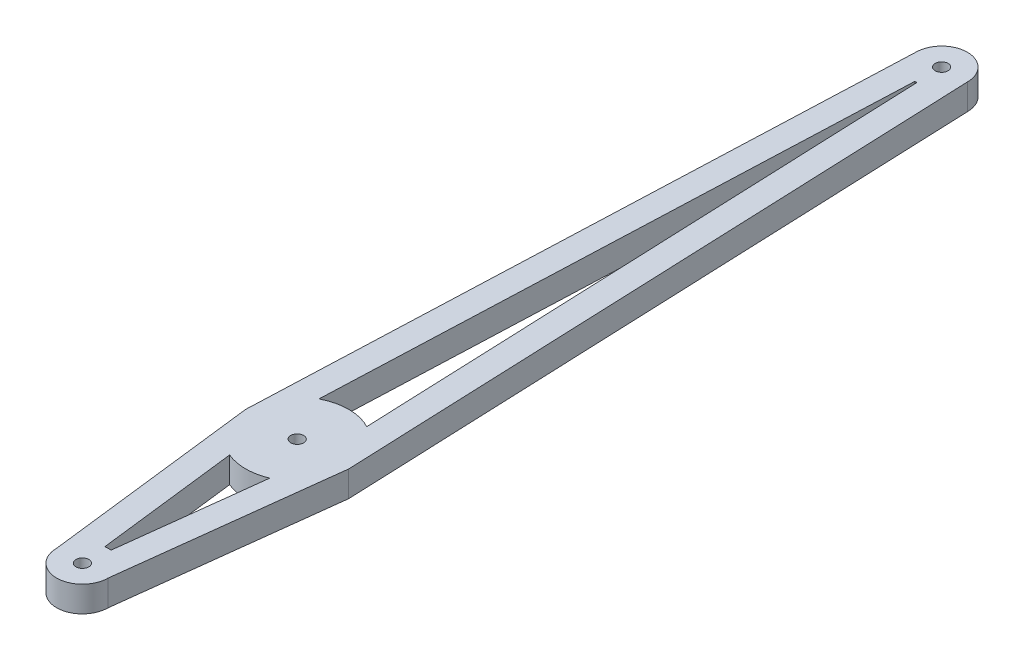
ISO-10303-21;
HEADER;
FILE_DESCRIPTION(('STEP AP214'),'2;1');
FILE_NAME('part.step','',(''),(''),'','','');
FILE_SCHEMA(('AUTOMOTIVE_DESIGN { 1 0 10303 214 1 1 1 1 }'));
ENDSEC;
DATA;
#1=APPLICATION_CONTEXT('core data for automotive mechanical design processes');
#2=APPLICATION_PROTOCOL_DEFINITION('international standard','automotive_design',2000,#1);
#3=PRODUCT_CONTEXT('',#1,'mechanical');
#4=PRODUCT('Part','Part','',(#3));
#5=PRODUCT_RELATED_PRODUCT_CATEGORY('part','',(#4));
#6=PRODUCT_DEFINITION_FORMATION('','',#4);
#7=PRODUCT_DEFINITION_CONTEXT('part definition',#1,'design');
#8=PRODUCT_DEFINITION('design','',#6,#7);
#9=PRODUCT_DEFINITION_SHAPE('','',#8);
#10=(LENGTH_UNIT() NAMED_UNIT(*) SI_UNIT(.MILLI.,.METRE.));
#11=(NAMED_UNIT(*) PLANE_ANGLE_UNIT() SI_UNIT($,.RADIAN.));
#12=(NAMED_UNIT(*) SI_UNIT($,.STERADIAN.) SOLID_ANGLE_UNIT());
#13=UNCERTAINTY_MEASURE_WITH_UNIT(LENGTH_MEASURE(1.E-05),#10,'distance_accuracy_value','');
#14=(GEOMETRIC_REPRESENTATION_CONTEXT(3) GLOBAL_UNCERTAINTY_ASSIGNED_CONTEXT((#13)) GLOBAL_UNIT_ASSIGNED_CONTEXT((#10,
#11,#12)) REPRESENTATION_CONTEXT('',''));
#15=CARTESIAN_POINT('',(0.,0.,0.));
#16=DIRECTION('',(0.,0.,1.));
#17=DIRECTION('',(1.,0.,0.));
#18=AXIS2_PLACEMENT_3D('',#15,#16,#17);
#19=CARTESIAN_POINT('',(0.,6.,0.));
#20=DIRECTION('',(0.,-1.,0.));
#21=DIRECTION('',(0.,0.,-1.));
#22=AXIS2_PLACEMENT_3D('',#19,#20,#21);
#23=CYLINDRICAL_SURFACE('',#22,12.);
#24=CARTESIAN_POINT('',(0.,0.,0.));
#25=DIRECTION('',(0.,1.,0.));
#26=DIRECTION('',(0.,0.,1.));
#27=AXIS2_PLACEMENT_3D('',#24,#25,#26);
#28=CIRCLE('',#27,12.);
#29=CARTESIAN_POINT('',(5.57494472584614,0.,-10.6263818538466));
#30=VERTEX_POINT('',#29);
#31=CARTESIAN_POINT('',(-5.57494472584614,0.,-10.6263818538466));
#32=VERTEX_POINT('',#31);
#33=EDGE_CURVE('E203',#30,#32,#28,.T.);
#34=ORIENTED_EDGE('',*,*,#33,.T.);
#35=DIRECTION('',(0.,-1.,0.));
#36=VECTOR('',#35,1.);
#37=CARTESIAN_POINT('',(-5.57494472584614,6.,-10.6263818538466));
#38=LINE('',#37,#36);
#39=CARTESIAN_POINT('',(-5.57494472584614,6.,-10.6263818538466));
#40=VERTEX_POINT('',#39);
#41=EDGE_CURVE('E11',#40,#32,#38,.T.);
#42=ORIENTED_EDGE('',*,*,#41,.F.);
#43=CARTESIAN_POINT('',(0.,6.,0.));
#44=DIRECTION('',(0.,1.,0.));
#45=DIRECTION('',(0.,0.,1.));
#46=AXIS2_PLACEMENT_3D('',#43,#44,#45);
#47=CIRCLE('',#46,12.);
#48=CARTESIAN_POINT('',(5.57494472584614,6.,-10.6263818538466));
#49=VERTEX_POINT('',#48);
#50=EDGE_CURVE('E163',#49,#40,#47,.T.);
#51=ORIENTED_EDGE('',*,*,#50,.F.);
#52=DIRECTION('',(0.,-1.,0.));
#53=VECTOR('',#52,1.);
#54=CARTESIAN_POINT('',(5.57494472584614,6.,-10.6263818538466));
#55=LINE('',#54,#53);
#56=EDGE_CURVE('E219',#49,#30,#55,.T.);
#57=ORIENTED_EDGE('',*,*,#56,.T.);
#58=EDGE_LOOP('',(#34,#42,#51,#57));
#59=FACE_BOUND('',#58,.T.);
#60=ADVANCED_FACE('F37',(#59),#23,.T.);
#61=CARTESIAN_POINT('',(-5.99041533546326,6.,-0.23961661341853));
#62=DIRECTION('',(0.999200958721789,0.,0.0399680383488716));
#63=DIRECTION('',(0.0399680383488716,0.,-0.99920095872179));
#64=AXIS2_PLACEMENT_3D('',#61,#62,#63);
#65=PLANE('',#64);
#66=DIRECTION('',(-0.0399680383488716,0.,0.99920095872179));
#67=VECTOR('',#66,1.);
#68=CARTESIAN_POINT('',(-5.99041533546326,0.,-0.23961661341853));
#69=LINE('',#68,#67);
#70=CARTESIAN_POINT('',(-0.239808230093231,0.,-144.004794247669));
#71=VERTEX_POINT('',#70);
#72=EDGE_CURVE('E154',#71,#32,#69,.T.);
#73=ORIENTED_EDGE('',*,*,#72,.F.);
#74=DIRECTION('',(0.,-1.,0.));
#75=VECTOR('',#74,1.);
#76=CARTESIAN_POINT('',(-0.239808230093231,6.,-144.004794247669));
#77=LINE('',#76,#75);
#78=CARTESIAN_POINT('',(-0.239808230093231,6.,-144.004794247669));
#79=VERTEX_POINT('',#78);
#80=EDGE_CURVE('E47',#79,#71,#77,.T.);
#81=ORIENTED_EDGE('',*,*,#80,.F.);
#82=DIRECTION('',(-0.0399680383488716,0.,0.99920095872179));
#83=VECTOR('',#82,1.);
#84=CARTESIAN_POINT('',(-5.99041533546326,6.,-0.23961661341853));
#85=LINE('',#84,#83);
#86=EDGE_CURVE('E152',#79,#40,#85,.T.);
#87=ORIENTED_EDGE('',*,*,#86,.T.);
#88=ORIENTED_EDGE('',*,*,#41,.T.);
#89=EDGE_LOOP('',(#73,#81,#87,#88));
#90=FACE_BOUND('',#89,.T.);
#91=ADVANCED_FACE('F150',(#90),#65,.T.);
#92=CARTESIAN_POINT('',(0.,6.,-150.));
#93=DIRECTION('',(0.,-1.,0.));
#94=DIRECTION('',(0.,0.,-1.));
#95=AXIS2_PLACEMENT_3D('',#92,#93,#94);
#96=CYLINDRICAL_SURFACE('',#95,6.);
#97=CARTESIAN_POINT('',(0.,0.,-150.));
#98=DIRECTION('',(0.,1.,0.));
#99=DIRECTION('',(0.,0.,1.));
#100=AXIS2_PLACEMENT_3D('',#97,#98,#99);
#101=CIRCLE('',#100,6.);
#102=CARTESIAN_POINT('',(0.239808230093231,0.,-144.004794247669));
#103=VERTEX_POINT('',#102);
#104=EDGE_CURVE('E101',#71,#103,#101,.T.);
#105=ORIENTED_EDGE('',*,*,#104,.T.);
#106=DIRECTION('',(0.,-1.,0.));
#107=VECTOR('',#106,1.);
#108=CARTESIAN_POINT('',(0.239808230093231,6.,-144.004794247669));
#109=LINE('',#108,#107);
#110=CARTESIAN_POINT('',(0.239808230093231,6.,-144.004794247669));
#111=VERTEX_POINT('',#110);
#112=EDGE_CURVE('E155',#111,#103,#109,.T.);
#113=ORIENTED_EDGE('',*,*,#112,.F.);
#114=CARTESIAN_POINT('',(0.,6.,-150.));
#115=DIRECTION('',(0.,1.,0.));
#116=DIRECTION('',(0.,0.,1.));
#117=AXIS2_PLACEMENT_3D('',#114,#115,#116);
#118=CIRCLE('',#117,6.);
#119=EDGE_CURVE('E157',#79,#111,#118,.T.);
#120=ORIENTED_EDGE('',*,*,#119,.F.);
#121=ORIENTED_EDGE('',*,*,#80,.T.);
#122=EDGE_LOOP('',(#105,#113,#120,#121));
#123=FACE_BOUND('',#122,.T.);
#124=ADVANCED_FACE('F158',(#123),#96,.T.);
#125=CARTESIAN_POINT('',(-5.91482649842271,6.,0.709779179810727));
#126=DIRECTION('',(0.992876838486922,0.,-0.119145220618431));
#127=DIRECTION('',(-0.119145220618431,0.,-0.992876838486922));
#128=AXIS2_PLACEMENT_3D('',#125,#126,#127);
#129=PLANE('',#128);
#130=DIRECTION('',(0.119145220618431,0.,0.992876838486922));
#131=VECTOR('',#130,1.);
#132=CARTESIAN_POINT('',(-5.91482649842271,0.,0.709779179810727));
#133=LINE('',#132,#131);
#134=CARTESIAN_POINT('',(-4.67370702240032,0.,11.0524414799973));
#135=VERTEX_POINT('',#134);
#136=CARTESIAN_POINT('',(-0.714871323710578,0.,44.0427389690785));
#137=VERTEX_POINT('',#136);
#138=EDGE_CURVE('E196',#135,#137,#133,.T.);
#139=ORIENTED_EDGE('',*,*,#138,.F.);
#140=DIRECTION('',(0.,-1.,0.));
#141=VECTOR('',#140,1.);
#142=CARTESIAN_POINT('',(-4.67370702240032,6.,11.0524414799973));
#143=LINE('',#142,#141);
#144=CARTESIAN_POINT('',(-4.67370702240032,6.,11.0524414799973));
#145=VERTEX_POINT('',#144);
#146=EDGE_CURVE('E221',#145,#135,#143,.T.);
#147=ORIENTED_EDGE('',*,*,#146,.F.);
#148=DIRECTION('',(0.119145220618431,0.,0.992876838486922));
#149=VECTOR('',#148,1.);
#150=CARTESIAN_POINT('',(-5.91482649842271,6.,0.709779179810727));
#151=LINE('',#150,#149);
#152=CARTESIAN_POINT('',(-0.714871323710578,6.,44.0427389690785));
#153=VERTEX_POINT('',#152);
#154=EDGE_CURVE('E276',#145,#153,#151,.T.);
#155=ORIENTED_EDGE('',*,*,#154,.T.);
#156=DIRECTION('',(0.,-1.,0.));
#157=VECTOR('',#156,1.);
#158=CARTESIAN_POINT('',(-0.714871323710578,6.,44.0427389690785));
#159=LINE('',#158,#157);
#160=EDGE_CURVE('E223',#153,#137,#159,.T.);
#161=ORIENTED_EDGE('',*,*,#160,.T.);
#162=EDGE_LOOP('',(#139,#147,#155,#161));
#163=FACE_BOUND('',#162,.T.);
#164=ADVANCED_FACE('F317',(#163),#129,.T.);
#165=CARTESIAN_POINT('',(4.67370702240032,0.,11.0524414799973));
#166=VERTEX_POINT('',#165);
#167=EDGE_CURVE('E199',#135,#166,#28,.T.);
#168=ORIENTED_EDGE('',*,*,#167,.T.);
#169=DIRECTION('',(0.,-1.,0.));
#170=VECTOR('',#169,1.);
#171=CARTESIAN_POINT('',(4.67370702240032,6.,11.0524414799973));
#172=LINE('',#171,#170);
#173=CARTESIAN_POINT('',(4.67370702240032,6.,11.0524414799973));
#174=VERTEX_POINT('',#173);
#175=EDGE_CURVE('E228',#174,#166,#172,.T.);
#176=ORIENTED_EDGE('',*,*,#175,.F.);
#177=EDGE_CURVE('E168',#145,#174,#47,.T.);
#178=ORIENTED_EDGE('',*,*,#177,.F.);
#179=ORIENTED_EDGE('',*,*,#146,.T.);
#180=EDGE_LOOP('',(#168,#176,#178,#179));
#181=FACE_BOUND('',#180,.T.);
#182=ADVANCED_FACE('F308',(#181),#23,.T.);
#183=CARTESIAN_POINT('',(5.91482649842272,6.,0.709779179810725));
#184=DIRECTION('',(0.992876838486922,0.,0.119145220618431));
#185=DIRECTION('',(0.119145220618431,0.,-0.992876838486922));
#186=AXIS2_PLACEMENT_3D('',#183,#184,#185);
#187=PLANE('',#186);
#188=DIRECTION('',(-0.119145220618431,0.,0.992876838486922));
#189=VECTOR('',#188,1.);
#190=CARTESIAN_POINT('',(5.91482649842272,0.,0.709779179810725));
#191=LINE('',#190,#189);
#192=CARTESIAN_POINT('',(0.714871323710589,0.,44.0427389690785));
#193=VERTEX_POINT('',#192);
#194=EDGE_CURVE('E202',#166,#193,#191,.T.);
#195=ORIENTED_EDGE('',*,*,#194,.T.);
#196=DIRECTION('',(0.,-1.,0.));
#197=VECTOR('',#196,1.);
#198=CARTESIAN_POINT('',(0.714871323710589,6.,44.0427389690785));
#199=LINE('',#198,#197);
#200=CARTESIAN_POINT('',(0.714871323710589,6.,44.0427389690785));
#201=VERTEX_POINT('',#200);
#202=EDGE_CURVE('E225',#201,#193,#199,.T.);
#203=ORIENTED_EDGE('',*,*,#202,.F.);
#204=DIRECTION('',(-0.119145220618431,0.,0.992876838486922));
#205=VECTOR('',#204,1.);
#206=CARTESIAN_POINT('',(5.91482649842272,6.,0.709779179810725));
#207=LINE('',#206,#205);
#208=EDGE_CURVE('E280',#174,#201,#207,.T.);
#209=ORIENTED_EDGE('',*,*,#208,.F.);
#210=ORIENTED_EDGE('',*,*,#175,.T.);
#211=EDGE_LOOP('',(#195,#203,#209,#210));
#212=FACE_BOUND('',#211,.T.);
#213=ADVANCED_FACE('F316',(#212),#187,.F.);
#214=CARTESIAN_POINT('',(0.,6.,-150.));
#215=DIRECTION('',(0.,-1.,0.));
#216=DIRECTION('',(0.,0.,-1.));
#217=AXIS2_PLACEMENT_3D('',#214,#215,#216);
#218=CYLINDRICAL_SURFACE('',#217,6.);
#219=CARTESIAN_POINT('',(0.,0.,-150.));
#220=DIRECTION('',(0.,1.,0.));
#221=DIRECTION('',(0.,0.,1.));
#222=AXIS2_PLACEMENT_3D('',#219,#220,#221);
#223=CIRCLE('',#222,6.);
#224=CARTESIAN_POINT('',(6.,0.,-150.));
#225=VERTEX_POINT('',#224);
#226=CARTESIAN_POINT('',(-6.,0.,-150.));
#227=VERTEX_POINT('',#226);
#228=EDGE_CURVE('E180',#225,#227,#223,.T.);
#229=ORIENTED_EDGE('',*,*,#228,.T.);
#230=DIRECTION('',(0.,-1.,0.));
#231=VECTOR('',#230,1.);
#232=CARTESIAN_POINT('',(-6.,6.,-150.));
#233=LINE('',#232,#231);
#234=CARTESIAN_POINT('',(-6.,6.,-150.));
#235=VERTEX_POINT('',#234);
#236=EDGE_CURVE('E41',#235,#227,#233,.T.);
#237=ORIENTED_EDGE('',*,*,#236,.F.);
#238=CARTESIAN_POINT('',(0.,6.,-150.));
#239=DIRECTION('',(0.,1.,0.));
#240=DIRECTION('',(0.,0.,1.));
#241=AXIS2_PLACEMENT_3D('',#238,#239,#240);
#242=CIRCLE('',#241,6.);
#243=CARTESIAN_POINT('',(6.,6.,-150.));
#244=VERTEX_POINT('',#243);
#245=EDGE_CURVE('E116',#244,#235,#242,.T.);
#246=ORIENTED_EDGE('',*,*,#245,.F.);
#247=DIRECTION('',(0.,-1.,0.));
#248=VECTOR('',#247,1.);
#249=CARTESIAN_POINT('',(6.,6.,-150.));
#250=LINE('',#249,#248);
#251=EDGE_CURVE('E176',#244,#225,#250,.T.);
#252=ORIENTED_EDGE('',*,*,#251,.T.);
#253=EDGE_LOOP('',(#229,#237,#246,#252));
#254=FACE_BOUND('',#253,.T.);
#255=ADVANCED_FACE('F251',(#254),#218,.T.);
#256=CARTESIAN_POINT('',(-11.9808306709265,6.,-0.47923322683706));
#257=DIRECTION('',(-0.999200958721789,0.,-0.0399680383488716));
#258=DIRECTION('',(-0.0399680383488716,0.,0.99920095872179));
#259=AXIS2_PLACEMENT_3D('',#256,#257,#258);
#260=PLANE('',#259);
#261=DIRECTION('',(0.0399680383488716,0.,-0.99920095872179));
#262=VECTOR('',#261,1.);
#263=CARTESIAN_POINT('',(-11.9808306709265,0.,-0.47923322683706));
#264=LINE('',#263,#262);
#265=CARTESIAN_POINT('',(-12.,0.,0.));
#266=VERTEX_POINT('',#265);
#267=EDGE_CURVE('E183',#266,#227,#264,.T.);
#268=ORIENTED_EDGE('',*,*,#267,.F.);
#269=DIRECTION('',(0.,-1.,0.));
#270=VECTOR('',#269,1.);
#271=CARTESIAN_POINT('',(-12.,6.,0.));
#272=LINE('',#271,#270);
#273=CARTESIAN_POINT('',(-12.,6.,0.));
#274=VERTEX_POINT('',#273);
#275=EDGE_CURVE('E240',#274,#266,#272,.T.);
#276=ORIENTED_EDGE('',*,*,#275,.F.);
#277=DIRECTION('',(0.0399680383488716,0.,-0.99920095872179));
#278=VECTOR('',#277,1.);
#279=CARTESIAN_POINT('',(-11.9808306709265,6.,-0.47923322683706));
#280=LINE('',#279,#278);
#281=EDGE_CURVE('E248',#274,#235,#280,.T.);
#282=ORIENTED_EDGE('',*,*,#281,.T.);
#283=ORIENTED_EDGE('',*,*,#236,.T.);
#284=EDGE_LOOP('',(#268,#276,#282,#283));
#285=FACE_BOUND('',#284,.T.);
#286=ADVANCED_FACE('F247',(#285),#260,.T.);
#287=CARTESIAN_POINT('',(-11.8296529968454,6.,1.41955835962145));
#288=DIRECTION('',(0.992876838486922,0.,-0.119145220618431));
#289=DIRECTION('',(-0.119145220618431,0.,-0.992876838486922));
#290=AXIS2_PLACEMENT_3D('',#287,#288,#289);
#291=PLANE('',#290);
#292=DIRECTION('',(0.119145220618431,0.,0.992876838486922));
#293=VECTOR('',#292,1.);
#294=CARTESIAN_POINT('',(-11.8296529968454,0.,1.41955835962145));
#295=LINE('',#294,#293);
#296=CARTESIAN_POINT('',(-5.99999999999999,0.,50.));
#297=VERTEX_POINT('',#296);
#298=EDGE_CURVE('E186',#266,#297,#295,.T.);
#299=ORIENTED_EDGE('',*,*,#298,.T.);
#300=DIRECTION('',(0.,-1.,0.));
#301=VECTOR('',#300,1.);
#302=CARTESIAN_POINT('',(-5.99999999999999,6.,50.));
#303=LINE('',#302,#301);
#304=CARTESIAN_POINT('',(-5.99999999999999,6.,50.));
#305=VERTEX_POINT('',#304);
#306=EDGE_CURVE('E238',#305,#297,#303,.T.);
#307=ORIENTED_EDGE('',*,*,#306,.F.);
#308=DIRECTION('',(0.119145220618431,0.,0.992876838486922));
#309=VECTOR('',#308,1.);
#310=CARTESIAN_POINT('',(-11.8296529968454,6.,1.41955835962145));
#311=LINE('',#310,#309);
#312=EDGE_CURVE('E268',#274,#305,#311,.T.);
#313=ORIENTED_EDGE('',*,*,#312,.F.);
#314=ORIENTED_EDGE('',*,*,#275,.T.);
#315=EDGE_LOOP('',(#299,#307,#313,#314));
#316=FACE_BOUND('',#315,.T.);
#317=ADVANCED_FACE('F259',(#316),#291,.F.);
#318=CARTESIAN_POINT('',(0.,6.,50.));
#319=DIRECTION('',(0.,-1.,0.));
#320=DIRECTION('',(0.,0.,-1.));
#321=AXIS2_PLACEMENT_3D('',#318,#319,#320);
#322=CYLINDRICAL_SURFACE('',#321,6.);
#323=CARTESIAN_POINT('',(0.,0.,50.));
#324=DIRECTION('',(0.,1.,0.));
#325=DIRECTION('',(0.,0.,1.));
#326=AXIS2_PLACEMENT_3D('',#323,#324,#325);
#327=CIRCLE('',#326,6.);
#328=CARTESIAN_POINT('',(6.00000000000001,0.,50.));
#329=VERTEX_POINT('',#328);
#330=EDGE_CURVE('E188',#297,#329,#327,.T.);
#331=ORIENTED_EDGE('',*,*,#330,.T.);
#332=DIRECTION('',(0.,-1.,0.));
#333=VECTOR('',#332,1.);
#334=CARTESIAN_POINT('',(6.00000000000001,6.,50.));
#335=LINE('',#334,#333);
#336=CARTESIAN_POINT('',(6.00000000000001,6.,50.));
#337=VERTEX_POINT('',#336);
#338=EDGE_CURVE('E236',#337,#329,#335,.T.);
#339=ORIENTED_EDGE('',*,*,#338,.F.);
#340=CARTESIAN_POINT('',(0.,6.,50.));
#341=DIRECTION('',(0.,1.,0.));
#342=DIRECTION('',(0.,0.,1.));
#343=AXIS2_PLACEMENT_3D('',#340,#341,#342);
#344=CIRCLE('',#343,6.);
#345=EDGE_CURVE('E264',#305,#337,#344,.T.);
#346=ORIENTED_EDGE('',*,*,#345,.F.);
#347=ORIENTED_EDGE('',*,*,#306,.T.);
#348=EDGE_LOOP('',(#331,#339,#346,#347));
#349=FACE_BOUND('',#348,.T.);
#350=ADVANCED_FACE('F262',(#349),#322,.T.);
#351=CARTESIAN_POINT('',(11.8296529968454,6.,1.41955835962145));
#352=DIRECTION('',(0.992876838486922,0.,0.11914522061843));
#353=DIRECTION('',(0.119145220618431,0.,-0.992876838486922));
#354=AXIS2_PLACEMENT_3D('',#351,#352,#353);
#355=PLANE('',#354);
#356=DIRECTION('',(-0.11914522061843,0.,0.992876838486922));
#357=VECTOR('',#356,1.);
#358=CARTESIAN_POINT('',(11.8296529968454,0.,1.41955835962145));
#359=LINE('',#358,#357);
#360=CARTESIAN_POINT('',(12.,0.,0.));
#361=VERTEX_POINT('',#360);
#362=EDGE_CURVE('E191',#361,#329,#359,.T.);
#363=ORIENTED_EDGE('',*,*,#362,.F.);
#364=DIRECTION('',(0.,-1.,0.));
#365=VECTOR('',#364,1.);
#366=CARTESIAN_POINT('',(12.,6.,0.));
#367=LINE('',#366,#365);
#368=CARTESIAN_POINT('',(12.,6.,0.));
#369=VERTEX_POINT('',#368);
#370=EDGE_CURVE('E234',#369,#361,#367,.T.);
#371=ORIENTED_EDGE('',*,*,#370,.F.);
#372=DIRECTION('',(-0.11914522061843,0.,0.992876838486922));
#373=VECTOR('',#372,1.);
#374=CARTESIAN_POINT('',(11.8296529968454,6.,1.41955835962145));
#375=LINE('',#374,#373);
#376=EDGE_CURVE('E267',#369,#337,#375,.T.);
#377=ORIENTED_EDGE('',*,*,#376,.T.);
#378=ORIENTED_EDGE('',*,*,#338,.T.);
#379=EDGE_LOOP('',(#363,#371,#377,#378));
#380=FACE_BOUND('',#379,.T.);
#381=ADVANCED_FACE('F346',(#380),#355,.T.);
#382=CARTESIAN_POINT('',(5.99041533546326,6.,-0.23961661341853));
#383=DIRECTION('',(0.999200958721789,0.,-0.0399680383488716));
#384=DIRECTION('',(-0.0399680383488716,0.,-0.99920095872179));
#385=AXIS2_PLACEMENT_3D('',#382,#383,#384);
#386=PLANE('',#385);
#387=DIRECTION('',(0.0399680383488716,0.,0.99920095872179));
#388=VECTOR('',#387,1.);
#389=CARTESIAN_POINT('',(5.99041533546326,0.,-0.23961661341853));
#390=LINE('',#389,#388);
#391=EDGE_CURVE('E107',#103,#30,#390,.T.);
#392=ORIENTED_EDGE('',*,*,#391,.T.);
#393=ORIENTED_EDGE('',*,*,#56,.F.);
#394=DIRECTION('',(0.0399680383488716,0.,0.99920095872179));
#395=VECTOR('',#394,1.);
#396=CARTESIAN_POINT('',(5.99041533546326,6.,-0.23961661341853));
#397=LINE('',#396,#395);
#398=EDGE_CURVE('E56',#111,#49,#397,.T.);
#399=ORIENTED_EDGE('',*,*,#398,.F.);
#400=ORIENTED_EDGE('',*,*,#112,.T.);
#401=EDGE_LOOP('',(#392,#393,#399,#400));
#402=FACE_BOUND('',#401,.T.);
#403=ADVANCED_FACE('F344',(#402),#386,.F.);
#404=CARTESIAN_POINT('',(0.,6.,50.));
#405=DIRECTION('',(0.,-1.,0.));
#406=DIRECTION('',(0.,0.,-1.));
#407=AXIS2_PLACEMENT_3D('',#404,#405,#406);
#408=CYLINDRICAL_SURFACE('',#407,1.5);
#409=CARTESIAN_POINT('',(0.,6.,50.));
#410=DIRECTION('',(0.,1.,0.));
#411=DIRECTION('',(0.,0.,1.));
#412=AXIS2_PLACEMENT_3D('',#409,#410,#411);
#413=CIRCLE('',#412,1.5);
#414=CARTESIAN_POINT('',(0.,6.,51.5));
#415=VERTEX_POINT('',#414);
#416=EDGE_CURVE('E166',#415,#415,#413,.T.);
#417=ORIENTED_EDGE('',*,*,#416,.T.);
#418=EDGE_LOOP('',(#417));
#419=FACE_BOUND('',#418,.T.);
#420=CARTESIAN_POINT('',(0.,0.,50.));
#421=DIRECTION('',(0.,1.,0.));
#422=DIRECTION('',(0.,0.,1.));
#423=AXIS2_PLACEMENT_3D('',#420,#421,#422);
#424=CIRCLE('',#423,1.5);
#425=CARTESIAN_POINT('',(0.,0.,51.5));
#426=VERTEX_POINT('',#425);
#427=EDGE_CURVE('E209',#426,#426,#424,.T.);
#428=ORIENTED_EDGE('',*,*,#427,.F.);
#429=EDGE_LOOP('',(#428));
#430=FACE_BOUND('',#429,.T.);
#431=ADVANCED_FACE('F289',(#419,#430),#408,.F.);
#432=CARTESIAN_POINT('',(0.,6.,50.));
#433=DIRECTION('',(0.,-1.,0.));
#434=DIRECTION('',(0.,0.,-1.));
#435=AXIS2_PLACEMENT_3D('',#432,#433,#434);
#436=CYLINDRICAL_SURFACE('',#435,6.);
#437=CARTESIAN_POINT('',(0.,0.,50.));
#438=DIRECTION('',(0.,1.,0.));
#439=DIRECTION('',(0.,0.,1.));
#440=AXIS2_PLACEMENT_3D('',#437,#438,#439);
#441=CIRCLE('',#440,6.);
#442=EDGE_CURVE('E206',#193,#137,#441,.T.);
#443=ORIENTED_EDGE('',*,*,#442,.T.);
#444=ORIENTED_EDGE('',*,*,#160,.F.);
#445=CARTESIAN_POINT('',(0.,6.,50.));
#446=DIRECTION('',(0.,1.,0.));
#447=DIRECTION('',(0.,0.,1.));
#448=AXIS2_PLACEMENT_3D('',#445,#446,#447);
#449=CIRCLE('',#448,6.);
#450=EDGE_CURVE('E282',#201,#153,#449,.T.);
#451=ORIENTED_EDGE('',*,*,#450,.F.);
#452=ORIENTED_EDGE('',*,*,#202,.T.);
#453=EDGE_LOOP('',(#443,#444,#451,#452));
#454=FACE_BOUND('',#453,.T.);
#455=ADVANCED_FACE('F333',(#454),#436,.T.);
#456=CARTESIAN_POINT('',(11.9808306709265,6.,-0.47923322683706));
#457=DIRECTION('',(-0.999200958721789,0.,0.0399680383488716));
#458=DIRECTION('',(0.0399680383488716,0.,0.99920095872179));
#459=AXIS2_PLACEMENT_3D('',#456,#457,#458);
#460=PLANE('',#459);
#461=DIRECTION('',(-0.0399680383488716,0.,-0.99920095872179));
#462=VECTOR('',#461,1.);
#463=CARTESIAN_POINT('',(11.9808306709265,0.,-0.47923322683706));
#464=LINE('',#463,#462);
#465=EDGE_CURVE('E194',#361,#225,#464,.T.);
#466=ORIENTED_EDGE('',*,*,#465,.T.);
#467=ORIENTED_EDGE('',*,*,#251,.F.);
#468=DIRECTION('',(-0.0399680383488716,0.,-0.99920095872179));
#469=VECTOR('',#468,1.);
#470=CARTESIAN_POINT('',(11.9808306709265,6.,-0.47923322683706));
#471=LINE('',#470,#469);
#472=EDGE_CURVE('E270',#369,#244,#471,.T.);
#473=ORIENTED_EDGE('',*,*,#472,.F.);
#474=ORIENTED_EDGE('',*,*,#370,.T.);
#475=EDGE_LOOP('',(#466,#467,#473,#474));
#476=FACE_BOUND('',#475,.T.);
#477=ADVANCED_FACE('F336',(#476),#460,.F.);
#478=CARTESIAN_POINT('',(0.,6.,-150.));
#479=DIRECTION('',(0.,-1.,0.));
#480=DIRECTION('',(0.,0.,-1.));
#481=AXIS2_PLACEMENT_3D('',#478,#479,#480);
#482=CYLINDRICAL_SURFACE('',#481,1.5);
#483=CARTESIAN_POINT('',(0.,6.,-150.));
#484=DIRECTION('',(0.,1.,0.));
#485=DIRECTION('',(0.,0.,1.));
#486=AXIS2_PLACEMENT_3D('',#483,#484,#485);
#487=CIRCLE('',#486,1.5);
#488=CARTESIAN_POINT('',(0.,6.,-148.5));
#489=VERTEX_POINT('',#488);
#490=EDGE_CURVE('E218',#489,#489,#487,.T.);
#491=ORIENTED_EDGE('',*,*,#490,.T.);
#492=EDGE_LOOP('',(#491));
#493=FACE_BOUND('',#492,.T.);
#494=CARTESIAN_POINT('',(0.,0.,-150.));
#495=DIRECTION('',(0.,1.,0.));
#496=DIRECTION('',(0.,0.,1.));
#497=AXIS2_PLACEMENT_3D('',#494,#495,#496);
#498=CIRCLE('',#497,1.5);
#499=CARTESIAN_POINT('',(0.,0.,-148.5));
#500=VERTEX_POINT('',#499);
#501=EDGE_CURVE('E177',#500,#500,#498,.T.);
#502=ORIENTED_EDGE('',*,*,#501,.F.);
#503=EDGE_LOOP('',(#502));
#504=FACE_BOUND('',#503,.T.);
#505=ADVANCED_FACE('F39',(#493,#504),#482,.F.);
#506=CARTESIAN_POINT('',(0.,6.,0.));
#507=DIRECTION('',(0.,-1.,0.));
#508=DIRECTION('',(0.,0.,-1.));
#509=AXIS2_PLACEMENT_3D('',#506,#507,#508);
#510=CYLINDRICAL_SURFACE('',#509,1.5);
#511=CARTESIAN_POINT('',(0.,6.,0.));
#512=DIRECTION('',(0.,1.,0.));
#513=DIRECTION('',(0.,0.,1.));
#514=AXIS2_PLACEMENT_3D('',#511,#512,#513);
#515=CIRCLE('',#514,1.5);
#516=CARTESIAN_POINT('',(0.,6.,1.5));
#517=VERTEX_POINT('',#516);
#518=EDGE_CURVE('E173',#517,#517,#515,.T.);
#519=ORIENTED_EDGE('',*,*,#518,.T.);
#520=EDGE_LOOP('',(#519));
#521=FACE_BOUND('',#520,.T.);
#522=CARTESIAN_POINT('',(0.,0.,0.));
#523=DIRECTION('',(0.,1.,0.));
#524=DIRECTION('',(0.,0.,1.));
#525=AXIS2_PLACEMENT_3D('',#522,#523,#524);
#526=CIRCLE('',#525,1.5);
#527=CARTESIAN_POINT('',(0.,0.,1.5));
#528=VERTEX_POINT('',#527);
#529=EDGE_CURVE('E215',#528,#528,#526,.T.);
#530=ORIENTED_EDGE('',*,*,#529,.F.);
#531=EDGE_LOOP('',(#530));
#532=FACE_BOUND('',#531,.T.);
#533=ADVANCED_FACE('F293',(#521,#532),#510,.F.);
#534=CARTESIAN_POINT('',(0.,6.,0.));
#535=DIRECTION('',(0.,1.,0.));
#536=DIRECTION('',(0.,0.,1.));
#537=AXIS2_PLACEMENT_3D('',#534,#535,#536);
#538=PLANE('',#537);
#539=ORIENTED_EDGE('',*,*,#490,.F.);
#540=EDGE_LOOP('',(#539));
#541=FACE_BOUND('',#540,.T.);
#542=ORIENTED_EDGE('',*,*,#245,.T.);
#543=ORIENTED_EDGE('',*,*,#281,.F.);
#544=ORIENTED_EDGE('',*,*,#312,.T.);
#545=ORIENTED_EDGE('',*,*,#345,.T.);
#546=ORIENTED_EDGE('',*,*,#376,.F.);
#547=ORIENTED_EDGE('',*,*,#472,.T.);
#548=EDGE_LOOP('',(#542,#543,#544,#545,#546,#547));
#549=FACE_BOUND('',#548,.T.);
#550=ORIENTED_EDGE('',*,*,#154,.F.);
#551=ORIENTED_EDGE('',*,*,#177,.T.);
#552=ORIENTED_EDGE('',*,*,#208,.T.);
#553=ORIENTED_EDGE('',*,*,#450,.T.);
#554=EDGE_LOOP('',(#550,#551,#552,#553));
#555=FACE_BOUND('',#554,.T.);
#556=ORIENTED_EDGE('',*,*,#416,.F.);
#557=EDGE_LOOP('',(#556));
#558=FACE_BOUND('',#557,.T.);
#559=ORIENTED_EDGE('',*,*,#50,.T.);
#560=ORIENTED_EDGE('',*,*,#86,.F.);
#561=ORIENTED_EDGE('',*,*,#119,.T.);
#562=ORIENTED_EDGE('',*,*,#398,.T.);
#563=EDGE_LOOP('',(#559,#560,#561,#562));
#564=FACE_BOUND('',#563,.T.);
#565=ORIENTED_EDGE('',*,*,#518,.F.);
#566=EDGE_LOOP('',(#565));
#567=FACE_BOUND('',#566,.T.);
#568=ADVANCED_FACE('F160',(#541,#549,#555,#558,#564,#567),#538,.T.);
#569=CARTESIAN_POINT('',(0.,0.,0.));
#570=DIRECTION('',(0.,1.,0.));
#571=DIRECTION('',(0.,0.,1.));
#572=AXIS2_PLACEMENT_3D('',#569,#570,#571);
#573=PLANE('',#572);
#574=ORIENTED_EDGE('',*,*,#501,.T.);
#575=EDGE_LOOP('',(#574));
#576=FACE_BOUND('',#575,.T.);
#577=ORIENTED_EDGE('',*,*,#228,.F.);
#578=ORIENTED_EDGE('',*,*,#465,.F.);
#579=ORIENTED_EDGE('',*,*,#362,.T.);
#580=ORIENTED_EDGE('',*,*,#330,.F.);
#581=ORIENTED_EDGE('',*,*,#298,.F.);
#582=ORIENTED_EDGE('',*,*,#267,.T.);
#583=EDGE_LOOP('',(#577,#578,#579,#580,#581,#582));
#584=FACE_BOUND('',#583,.T.);
#585=ORIENTED_EDGE('',*,*,#138,.T.);
#586=ORIENTED_EDGE('',*,*,#442,.F.);
#587=ORIENTED_EDGE('',*,*,#194,.F.);
#588=ORIENTED_EDGE('',*,*,#167,.F.);
#589=EDGE_LOOP('',(#585,#586,#587,#588));
#590=FACE_BOUND('',#589,.T.);
#591=ORIENTED_EDGE('',*,*,#427,.T.);
#592=EDGE_LOOP('',(#591));
#593=FACE_BOUND('',#592,.T.);
#594=ORIENTED_EDGE('',*,*,#33,.F.);
#595=ORIENTED_EDGE('',*,*,#391,.F.);
#596=ORIENTED_EDGE('',*,*,#104,.F.);
#597=ORIENTED_EDGE('',*,*,#72,.T.);
#598=EDGE_LOOP('',(#594,#595,#596,#597));
#599=FACE_BOUND('',#598,.T.);
#600=ORIENTED_EDGE('',*,*,#529,.T.);
#601=EDGE_LOOP('',(#600));
#602=FACE_BOUND('',#601,.T.);
#603=ADVANCED_FACE('F255',(#576,#584,#590,#593,#599,#602),#573,.F.);
#604=CLOSED_SHELL('',(#60,#91,#124,#164,#182,#213,#255,#286,#317,#350,#381,#403,#431,#455,#477,
#505,#533,#568,#603));
#605=MANIFOLD_SOLID_BREP('B2',#604);
#606=ADVANCED_BREP_SHAPE_REPRESENTATION('',(#18,#605),#14);
#607=SHAPE_DEFINITION_REPRESENTATION(#9,#606);
ENDSEC;
END-ISO-10303-21;
